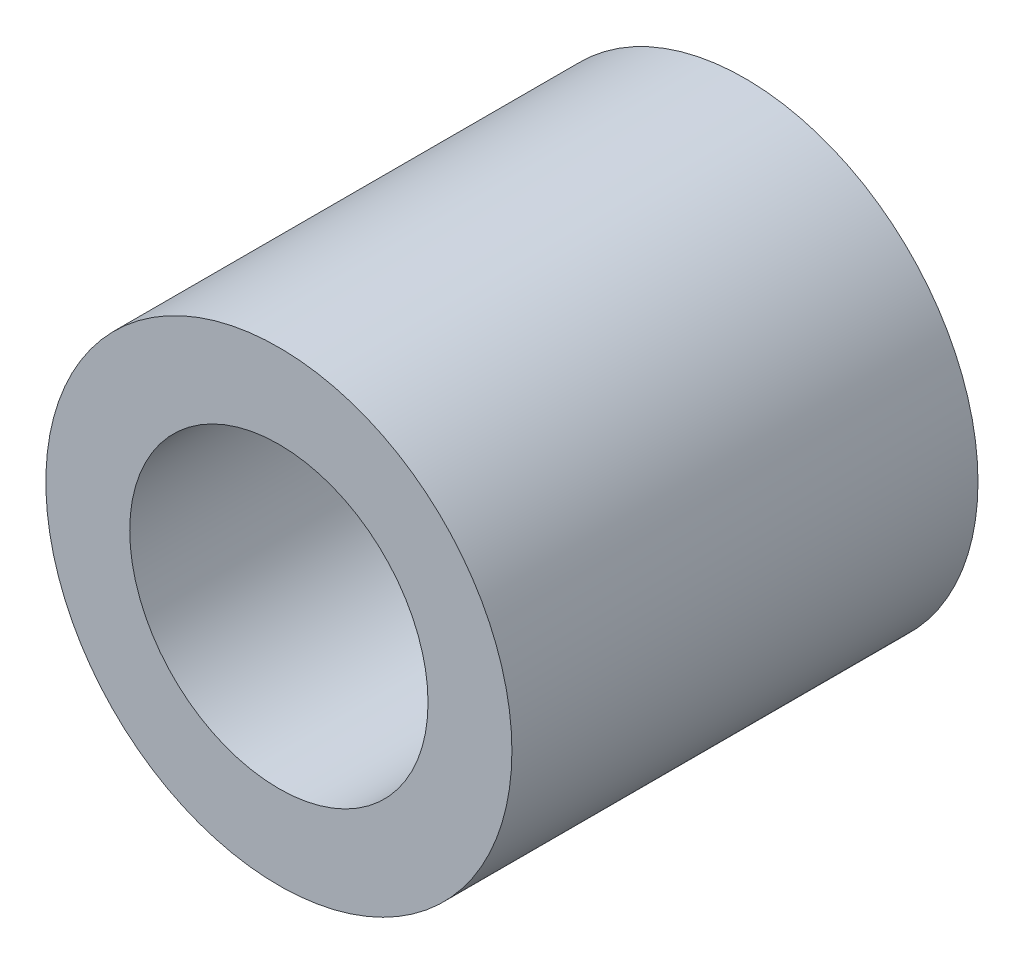
ISO-10303-21;
HEADER;
FILE_DESCRIPTION(('STEP AP214'),'2;1');
FILE_NAME('part.step','',(''),(''),'','','');
FILE_SCHEMA(('AUTOMOTIVE_DESIGN { 1 0 10303 214 1 1 1 1 }'));
ENDSEC;
DATA;
#1=APPLICATION_CONTEXT('core data for automotive mechanical design processes');
#2=APPLICATION_PROTOCOL_DEFINITION('international standard','automotive_design',2000,#1);
#3=PRODUCT_CONTEXT('',#1,'mechanical');
#4=PRODUCT('Part','Part','',(#3));
#5=PRODUCT_RELATED_PRODUCT_CATEGORY('part','',(#4));
#6=PRODUCT_DEFINITION_FORMATION('','',#4);
#7=PRODUCT_DEFINITION_CONTEXT('part definition',#1,'design');
#8=PRODUCT_DEFINITION('design','',#6,#7);
#9=PRODUCT_DEFINITION_SHAPE('','',#8);
#10=(LENGTH_UNIT() NAMED_UNIT(*) SI_UNIT(.MILLI.,.METRE.));
#11=(NAMED_UNIT(*) PLANE_ANGLE_UNIT() SI_UNIT($,.RADIAN.));
#12=(NAMED_UNIT(*) SI_UNIT($,.STERADIAN.) SOLID_ANGLE_UNIT());
#13=UNCERTAINTY_MEASURE_WITH_UNIT(LENGTH_MEASURE(1.E-05),#10,'distance_accuracy_value','');
#14=(GEOMETRIC_REPRESENTATION_CONTEXT(3) GLOBAL_UNCERTAINTY_ASSIGNED_CONTEXT((#13)) GLOBAL_UNIT_ASSIGNED_CONTEXT((#10,
#11,#12)) REPRESENTATION_CONTEXT('',''));
#15=CARTESIAN_POINT('',(0.,0.,0.));
#16=DIRECTION('',(0.,0.,1.));
#17=DIRECTION('',(1.,0.,0.));
#18=AXIS2_PLACEMENT_3D('',#15,#16,#17);
#19=CARTESIAN_POINT('',(0.,0.,5.));
#20=DIRECTION('',(0.,0.,1.));
#21=DIRECTION('',(1.,0.,0.));
#22=AXIS2_PLACEMENT_3D('',#19,#20,#21);
#23=PLANE('',#22);
#24=CARTESIAN_POINT('',(0.,0.,5.));
#25=DIRECTION('',(0.,0.,1.));
#26=DIRECTION('',(1.,0.,0.));
#27=AXIS2_PLACEMENT_3D('',#24,#25,#26);
#28=CIRCLE('',#27,2.5);
#29=CARTESIAN_POINT('',(2.5,0.,5.));
#30=VERTEX_POINT('',#29);
#31=EDGE_CURVE('E10',#30,#30,#28,.T.);
#32=ORIENTED_EDGE('',*,*,#31,.T.);
#33=EDGE_LOOP('',(#32));
#34=FACE_BOUND('',#33,.T.);
#35=CARTESIAN_POINT('',(0.,0.,5.));
#36=DIRECTION('',(0.,0.,1.));
#37=DIRECTION('',(1.,0.,0.));
#38=AXIS2_PLACEMENT_3D('',#35,#36,#37);
#39=CIRCLE('',#38,1.6);
#40=CARTESIAN_POINT('',(1.6,0.,5.));
#41=VERTEX_POINT('',#40);
#42=EDGE_CURVE('E50',#41,#41,#39,.T.);
#43=ORIENTED_EDGE('',*,*,#42,.F.);
#44=EDGE_LOOP('',(#43));
#45=FACE_BOUND('',#44,.T.);
#46=ADVANCED_FACE('F39',(#34,#45),#23,.T.);
#47=CARTESIAN_POINT('',(0.,0.,0.));
#48=DIRECTION('',(0.,0.,1.));
#49=DIRECTION('',(1.,0.,0.));
#50=AXIS2_PLACEMENT_3D('',#47,#48,#49);
#51=PLANE('',#50);
#52=CARTESIAN_POINT('',(0.,0.,0.));
#53=DIRECTION('',(0.,0.,1.));
#54=DIRECTION('',(1.,0.,0.));
#55=AXIS2_PLACEMENT_3D('',#52,#53,#54);
#56=CIRCLE('',#55,2.5);
#57=CARTESIAN_POINT('',(2.5,0.,0.));
#58=VERTEX_POINT('',#57);
#59=EDGE_CURVE('E43',#58,#58,#56,.T.);
#60=ORIENTED_EDGE('',*,*,#59,.F.);
#61=EDGE_LOOP('',(#60));
#62=FACE_BOUND('',#61,.T.);
#63=CARTESIAN_POINT('',(0.,0.,0.));
#64=DIRECTION('',(0.,0.,1.));
#65=DIRECTION('',(1.,0.,0.));
#66=AXIS2_PLACEMENT_3D('',#63,#64,#65);
#67=CIRCLE('',#66,1.6);
#68=CARTESIAN_POINT('',(1.6,0.,0.));
#69=VERTEX_POINT('',#68);
#70=EDGE_CURVE('E52',#69,#69,#67,.T.);
#71=ORIENTED_EDGE('',*,*,#70,.T.);
#72=EDGE_LOOP('',(#71));
#73=FACE_BOUND('',#72,.T.);
#74=ADVANCED_FACE('F62',(#62,#73),#51,.F.);
#75=CARTESIAN_POINT('',(0.,0.,5.));
#76=DIRECTION('',(0.,0.,-1.));
#77=DIRECTION('',(-1.,0.,0.));
#78=AXIS2_PLACEMENT_3D('',#75,#76,#77);
#79=CYLINDRICAL_SURFACE('',#78,2.5);
#80=ORIENTED_EDGE('',*,*,#31,.F.);
#81=EDGE_LOOP('',(#80));
#82=FACE_BOUND('',#81,.T.);
#83=ORIENTED_EDGE('',*,*,#59,.T.);
#84=EDGE_LOOP('',(#83));
#85=FACE_BOUND('',#84,.T.);
#86=ADVANCED_FACE('F41',(#82,#85),#79,.T.);
#87=CARTESIAN_POINT('',(0.,0.,5.));
#88=DIRECTION('',(0.,0.,-1.));
#89=DIRECTION('',(-1.,0.,0.));
#90=AXIS2_PLACEMENT_3D('',#87,#88,#89);
#91=CYLINDRICAL_SURFACE('',#90,1.6);
#92=ORIENTED_EDGE('',*,*,#42,.T.);
#93=EDGE_LOOP('',(#92));
#94=FACE_BOUND('',#93,.T.);
#95=ORIENTED_EDGE('',*,*,#70,.F.);
#96=EDGE_LOOP('',(#95));
#97=FACE_BOUND('',#96,.T.);
#98=ADVANCED_FACE('F58',(#94,#97),#91,.F.);
#99=CLOSED_SHELL('',(#46,#74,#86,#98));
#100=MANIFOLD_SOLID_BREP('B2',#99);
#101=ADVANCED_BREP_SHAPE_REPRESENTATION('',(#18,#100),#14);
#102=SHAPE_DEFINITION_REPRESENTATION(#9,#101);
ENDSEC;
END-ISO-10303-21;
